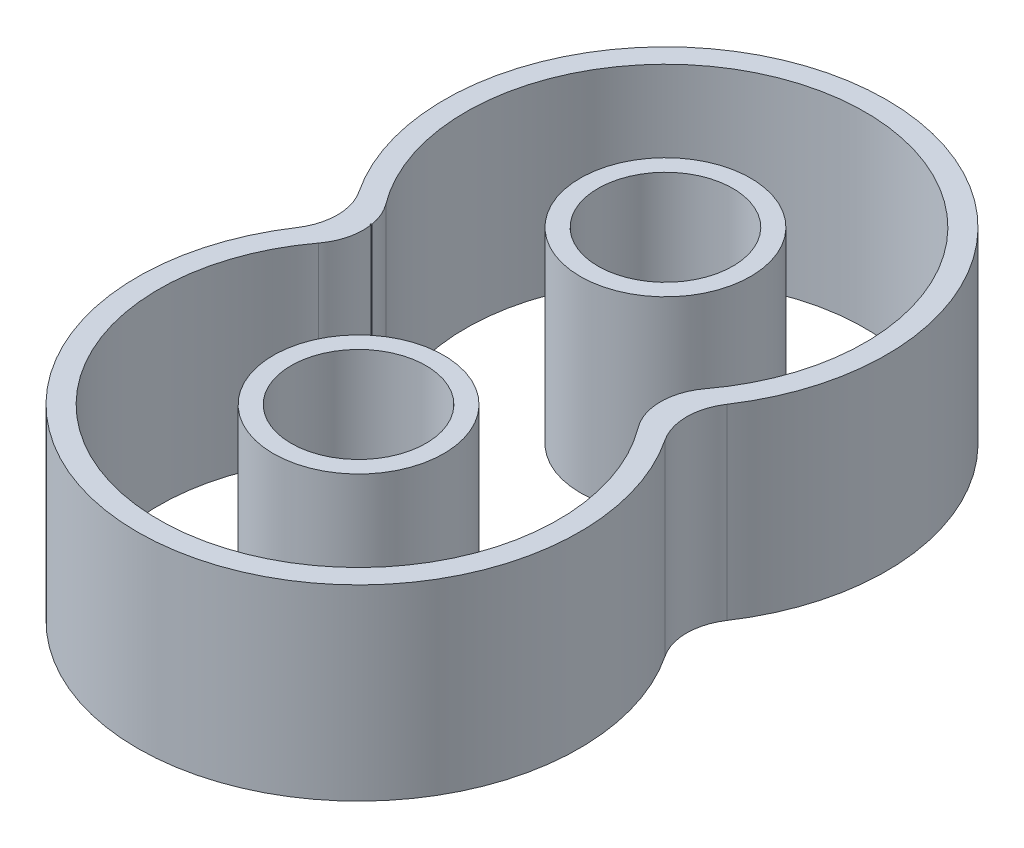
ISO-10303-21;
HEADER;
FILE_DESCRIPTION(('STEP AP214'),'2;1');
FILE_NAME('part.step','',(''),(''),'','','');
FILE_SCHEMA(('AUTOMOTIVE_DESIGN { 1 0 10303 214 1 1 1 1 }'));
ENDSEC;
DATA;
#1=APPLICATION_CONTEXT('core data for automotive mechanical design processes');
#2=APPLICATION_PROTOCOL_DEFINITION('international standard','automotive_design',2000,#1);
#3=PRODUCT_CONTEXT('',#1,'mechanical');
#4=PRODUCT('Part','Part','',(#3));
#5=PRODUCT_RELATED_PRODUCT_CATEGORY('part','',(#4));
#6=PRODUCT_DEFINITION_FORMATION('','',#4);
#7=PRODUCT_DEFINITION_CONTEXT('part definition',#1,'design');
#8=PRODUCT_DEFINITION('design','',#6,#7);
#9=PRODUCT_DEFINITION_SHAPE('','',#8);
#10=(LENGTH_UNIT() NAMED_UNIT(*) SI_UNIT(.MILLI.,.METRE.));
#11=(NAMED_UNIT(*) PLANE_ANGLE_UNIT() SI_UNIT($,.RADIAN.));
#12=(NAMED_UNIT(*) SI_UNIT($,.STERADIAN.) SOLID_ANGLE_UNIT());
#13=UNCERTAINTY_MEASURE_WITH_UNIT(LENGTH_MEASURE(1.E-05),#10,'distance_accuracy_value','');
#14=(GEOMETRIC_REPRESENTATION_CONTEXT(3) GLOBAL_UNCERTAINTY_ASSIGNED_CONTEXT((#13)) GLOBAL_UNIT_ASSIGNED_CONTEXT((#10,
#11,#12)) REPRESENTATION_CONTEXT('',''));
#15=CARTESIAN_POINT('',(0.,0.,0.));
#16=DIRECTION('',(0.,0.,1.));
#17=DIRECTION('',(1.,0.,0.));
#18=AXIS2_PLACEMENT_3D('',#15,#16,#17);
#19=CARTESIAN_POINT('',(-1.98283621732118,100.,81.9317745282291));
#20=DIRECTION('',(0.,-1.,0.));
#21=DIRECTION('',(0.,0.,-1.));
#22=AXIS2_PLACEMENT_3D('',#19,#20,#21);
#23=CYLINDRICAL_SURFACE('',#22,45.5);
#24=CARTESIAN_POINT('',(-1.98283621732118,100.,81.9317745282291));
#25=DIRECTION('',(0.,1.,0.));
#26=DIRECTION('',(0.,0.,1.));
#27=AXIS2_PLACEMENT_3D('',#24,#25,#26);
#28=CIRCLE('',#27,45.5);
#29=CARTESIAN_POINT('',(-1.98283621732118,100.,127.431774528229));
#30=VERTEX_POINT('',#29);
#31=EDGE_CURVE('E79',#30,#30,#28,.T.);
#32=ORIENTED_EDGE('',*,*,#31,.F.);
#33=EDGE_LOOP('',(#32));
#34=FACE_BOUND('',#33,.T.);
#35=CARTESIAN_POINT('',(-1.98283621732118,0.,81.9317745282291));
#36=DIRECTION('',(0.,1.,0.));
#37=DIRECTION('',(0.,0.,1.));
#38=AXIS2_PLACEMENT_3D('',#35,#36,#37);
#39=CIRCLE('',#38,45.5);
#40=CARTESIAN_POINT('',(-1.98283621732118,0.,127.431774528229));
#41=VERTEX_POINT('',#40);
#42=EDGE_CURVE('E85',#41,#41,#39,.T.);
#43=ORIENTED_EDGE('',*,*,#42,.T.);
#44=EDGE_LOOP('',(#43));
#45=FACE_BOUND('',#44,.T.);
#46=ADVANCED_FACE('F72',(#34,#45),#23,.T.);
#47=CARTESIAN_POINT('',(-1.98283621732118,100.,81.9317745282291));
#48=DIRECTION('',(0.,-1.,0.));
#49=DIRECTION('',(0.,0.,-1.));
#50=AXIS2_PLACEMENT_3D('',#47,#48,#49);
#51=CYLINDRICAL_SURFACE('',#50,36.);
#52=CARTESIAN_POINT('',(-1.98283621732118,100.,81.9317745282291));
#53=DIRECTION('',(0.,1.,0.));
#54=DIRECTION('',(0.,0.,1.));
#55=AXIS2_PLACEMENT_3D('',#52,#53,#54);
#56=CIRCLE('',#55,36.);
#57=CARTESIAN_POINT('',(-1.98283621732118,100.,117.931774528229));
#58=VERTEX_POINT('',#57);
#59=EDGE_CURVE('E12',#58,#58,#56,.T.);
#60=ORIENTED_EDGE('',*,*,#59,.T.);
#61=EDGE_LOOP('',(#60));
#62=FACE_BOUND('',#61,.T.);
#63=CARTESIAN_POINT('',(-1.98283621732118,0.,81.9317745282291));
#64=DIRECTION('',(0.,1.,0.));
#65=DIRECTION('',(0.,0.,1.));
#66=AXIS2_PLACEMENT_3D('',#63,#64,#65);
#67=CIRCLE('',#66,36.);
#68=CARTESIAN_POINT('',(-1.98283621732118,0.,117.931774528229));
#69=VERTEX_POINT('',#68);
#70=EDGE_CURVE('E75',#69,#69,#67,.T.);
#71=ORIENTED_EDGE('',*,*,#70,.F.);
#72=EDGE_LOOP('',(#71));
#73=FACE_BOUND('',#72,.T.);
#74=ADVANCED_FACE('F94',(#62,#73),#51,.F.);
#75=CARTESIAN_POINT('',(0.,100.,0.));
#76=DIRECTION('',(0.,1.,0.));
#77=DIRECTION('',(0.,0.,1.));
#78=AXIS2_PLACEMENT_3D('',#75,#76,#77);
#79=PLANE('',#78);
#80=ORIENTED_EDGE('',*,*,#31,.T.);
#81=EDGE_LOOP('',(#80));
#82=FACE_BOUND('',#81,.T.);
#83=ORIENTED_EDGE('',*,*,#59,.F.);
#84=EDGE_LOOP('',(#83));
#85=FACE_BOUND('',#84,.T.);
#86=ADVANCED_FACE('F96',(#82,#85),#79,.T.);
#87=CARTESIAN_POINT('',(0.,0.,0.));
#88=DIRECTION('',(0.,1.,0.));
#89=DIRECTION('',(0.,0.,1.));
#90=AXIS2_PLACEMENT_3D('',#87,#88,#89);
#91=PLANE('',#90);
#92=ORIENTED_EDGE('',*,*,#42,.F.);
#93=EDGE_LOOP('',(#92));
#94=FACE_BOUND('',#93,.T.);
#95=ORIENTED_EDGE('',*,*,#70,.T.);
#96=EDGE_LOOP('',(#95));
#97=FACE_BOUND('',#96,.T.);
#98=ADVANCED_FACE('F92',(#94,#97),#91,.F.);
#99=CLOSED_SHELL('',(#46,#74,#86,#98));
#100=MANIFOLD_SOLID_BREP('B2',#99);
#101=CARTESIAN_POINT('',(-1.98283621732118,100.,-81.9317745282293));
#102=DIRECTION('',(0.,-1.,0.));
#103=DIRECTION('',(0.,0.,-1.));
#104=AXIS2_PLACEMENT_3D('',#101,#102,#103);
#105=CYLINDRICAL_SURFACE('',#104,45.5);
#106=CARTESIAN_POINT('',(-1.98283621732118,100.,-81.9317745282293));
#107=DIRECTION('',(0.,1.,0.));
#108=DIRECTION('',(0.,0.,1.));
#109=AXIS2_PLACEMENT_3D('',#106,#107,#108);
#110=CIRCLE('',#109,45.5);
#111=CARTESIAN_POINT('',(-1.98283621732118,100.,-36.4317745282293));
#112=VERTEX_POINT('',#111);
#113=EDGE_CURVE('E156',#112,#112,#110,.T.);
#114=ORIENTED_EDGE('',*,*,#113,.F.);
#115=EDGE_LOOP('',(#114));
#116=FACE_BOUND('',#115,.T.);
#117=CARTESIAN_POINT('',(-1.98283621732118,0.,-81.9317745282293));
#118=DIRECTION('',(0.,1.,0.));
#119=DIRECTION('',(0.,0.,1.));
#120=AXIS2_PLACEMENT_3D('',#117,#118,#119);
#121=CIRCLE('',#120,45.5);
#122=CARTESIAN_POINT('',(-1.98283621732118,0.,-36.4317745282293));
#123=VERTEX_POINT('',#122);
#124=EDGE_CURVE('E162',#123,#123,#121,.T.);
#125=ORIENTED_EDGE('',*,*,#124,.T.);
#126=EDGE_LOOP('',(#125));
#127=FACE_BOUND('',#126,.T.);
#128=ADVANCED_FACE('F149',(#116,#127),#105,.T.);
#129=CARTESIAN_POINT('',(-1.98283621732118,100.,-81.9317745282293));
#130=DIRECTION('',(0.,-1.,0.));
#131=DIRECTION('',(0.,0.,-1.));
#132=AXIS2_PLACEMENT_3D('',#129,#130,#131);
#133=CYLINDRICAL_SURFACE('',#132,36.);
#134=CARTESIAN_POINT('',(-1.98283621732118,100.,-81.9317745282293));
#135=DIRECTION('',(0.,1.,0.));
#136=DIRECTION('',(0.,0.,1.));
#137=AXIS2_PLACEMENT_3D('',#134,#135,#136);
#138=CIRCLE('',#137,36.);
#139=CARTESIAN_POINT('',(-1.98283621732118,100.,-45.9317745282293));
#140=VERTEX_POINT('',#139);
#141=EDGE_CURVE('E71',#140,#140,#138,.T.);
#142=ORIENTED_EDGE('',*,*,#141,.T.);
#143=EDGE_LOOP('',(#142));
#144=FACE_BOUND('',#143,.T.);
#145=CARTESIAN_POINT('',(-1.98283621732118,0.,-81.9317745282293));
#146=DIRECTION('',(0.,1.,0.));
#147=DIRECTION('',(0.,0.,1.));
#148=AXIS2_PLACEMENT_3D('',#145,#146,#147);
#149=CIRCLE('',#148,36.);
#150=CARTESIAN_POINT('',(-1.98283621732118,0.,-45.9317745282293));
#151=VERTEX_POINT('',#150);
#152=EDGE_CURVE('E152',#151,#151,#149,.T.);
#153=ORIENTED_EDGE('',*,*,#152,.F.);
#154=EDGE_LOOP('',(#153));
#155=FACE_BOUND('',#154,.T.);
#156=ADVANCED_FACE('F171',(#144,#155),#133,.F.);
#157=CARTESIAN_POINT('',(0.,100.,0.));
#158=DIRECTION('',(0.,1.,0.));
#159=DIRECTION('',(0.,0.,1.));
#160=AXIS2_PLACEMENT_3D('',#157,#158,#159);
#161=PLANE('',#160);
#162=ORIENTED_EDGE('',*,*,#113,.T.);
#163=EDGE_LOOP('',(#162));
#164=FACE_BOUND('',#163,.T.);
#165=ORIENTED_EDGE('',*,*,#141,.F.);
#166=EDGE_LOOP('',(#165));
#167=FACE_BOUND('',#166,.T.);
#168=ADVANCED_FACE('F173',(#164,#167),#161,.T.);
#169=CARTESIAN_POINT('',(0.,0.,0.));
#170=DIRECTION('',(0.,1.,0.));
#171=DIRECTION('',(0.,0.,1.));
#172=AXIS2_PLACEMENT_3D('',#169,#170,#171);
#173=PLANE('',#172);
#174=ORIENTED_EDGE('',*,*,#124,.F.);
#175=EDGE_LOOP('',(#174));
#176=FACE_BOUND('',#175,.T.);
#177=ORIENTED_EDGE('',*,*,#152,.T.);
#178=EDGE_LOOP('',(#177));
#179=FACE_BOUND('',#178,.T.);
#180=ADVANCED_FACE('F169',(#176,#179),#173,.F.);
#181=CLOSED_SHELL('',(#128,#156,#168,#180));
#182=MANIFOLD_SOLID_BREP('B7',#181);
#183=CARTESIAN_POINT('',(-125.25920559196,100.,0.));
#184=DIRECTION('',(0.,-1.,0.));
#185=DIRECTION('',(0.,0.,-1.));
#186=AXIS2_PLACEMENT_3D('',#183,#184,#185);
#187=CYLINDRICAL_SURFACE('',#186,30.);
#188=CARTESIAN_POINT('',(-125.25920559196,0.,0.));
#189=DIRECTION('',(0.,1.,0.));
#190=DIRECTION('',(0.,0.,1.));
#191=AXIS2_PLACEMENT_3D('',#188,#189,#190);
#192=CIRCLE('',#191,30.);
#193=CARTESIAN_POINT('',(-100.274105053116,0.,-16.6055638586549));
#194=VERTEX_POINT('',#193);
#195=CARTESIAN_POINT('',(-100.274105053116,0.,16.6055638586547));
#196=VERTEX_POINT('',#195);
#197=EDGE_CURVE('E351',#194,#196,#192,.F.);
#198=ORIENTED_EDGE('',*,*,#197,.T.);
#199=DIRECTION('',(0.,-1.,0.));
#200=VECTOR('',#199,1.);
#201=CARTESIAN_POINT('',(-100.274105053116,100.,16.6055638586547));
#202=LINE('',#201,#200);
#203=CARTESIAN_POINT('',(-100.274105053116,100.,16.6055638586547));
#204=VERTEX_POINT('',#203);
#205=EDGE_CURVE('E147',#204,#196,#202,.T.);
#206=ORIENTED_EDGE('',*,*,#205,.F.);
#207=CARTESIAN_POINT('',(-125.25920559196,100.,0.));
#208=DIRECTION('',(0.,1.,0.));
#209=DIRECTION('',(0.,0.,1.));
#210=AXIS2_PLACEMENT_3D('',#207,#208,#209);
#211=CIRCLE('',#210,30.);
#212=CARTESIAN_POINT('',(-100.274105053116,100.,-16.6055638586549));
#213=VERTEX_POINT('',#212);
#214=EDGE_CURVE('E316',#213,#204,#211,.F.);
#215=ORIENTED_EDGE('',*,*,#214,.F.);
#216=DIRECTION('',(0.,-1.,0.));
#217=VECTOR('',#216,1.);
#218=CARTESIAN_POINT('',(-100.274105053116,100.,-16.6055638586549));
#219=LINE('',#218,#217);
#220=EDGE_CURVE('E358',#213,#194,#219,.T.);
#221=ORIENTED_EDGE('',*,*,#220,.T.);
#222=EDGE_LOOP('',(#198,#206,#215,#221));
#223=FACE_BOUND('',#222,.T.);
#224=ADVANCED_FACE('F217',(#223),#187,.F.);
#225=CARTESIAN_POINT('',(-1.98283621732118,100.,81.9317745282291));
#226=DIRECTION('',(0.,-1.,0.));
#227=DIRECTION('',(0.,0.,-1.));
#228=AXIS2_PLACEMENT_3D('',#225,#226,#227);
#229=CYLINDRICAL_SURFACE('',#228,118.019859895681);
#230=CARTESIAN_POINT('',(-1.98283621732118,0.,81.9317745282291));
#231=DIRECTION('',(0.,1.,0.));
#232=DIRECTION('',(0.,0.,1.));
#233=AXIS2_PLACEMENT_3D('',#230,#231,#232);
#234=CIRCLE('',#233,118.019859895681);
#235=CARTESIAN_POINT('',(96.3084326184739,0.,16.6055638586547));
#236=VERTEX_POINT('',#235);
#237=EDGE_CURVE('E321',#196,#236,#234,.T.);
#238=ORIENTED_EDGE('',*,*,#237,.T.);
#239=DIRECTION('',(0.,-1.,0.));
#240=VECTOR('',#239,1.);
#241=CARTESIAN_POINT('',(96.3084326184739,100.,16.6055638586547));
#242=LINE('',#241,#240);
#243=CARTESIAN_POINT('',(96.3084326184739,100.,16.6055638586547));
#244=VERTEX_POINT('',#243);
#245=EDGE_CURVE('E227',#244,#236,#242,.T.);
#246=ORIENTED_EDGE('',*,*,#245,.F.);
#247=CARTESIAN_POINT('',(-1.98283621732118,100.,81.9317745282291));
#248=DIRECTION('',(0.,1.,0.));
#249=DIRECTION('',(0.,0.,1.));
#250=AXIS2_PLACEMENT_3D('',#247,#248,#249);
#251=CIRCLE('',#250,118.019859895681);
#252=EDGE_CURVE('E310',#204,#244,#251,.T.);
#253=ORIENTED_EDGE('',*,*,#252,.F.);
#254=ORIENTED_EDGE('',*,*,#205,.T.);
#255=EDGE_LOOP('',(#238,#246,#253,#254));
#256=FACE_BOUND('',#255,.T.);
#257=ADVANCED_FACE('F320',(#256),#229,.T.);
#258=CARTESIAN_POINT('',(121.293533157318,100.,0.));
#259=DIRECTION('',(0.,-1.,0.));
#260=DIRECTION('',(0.,0.,-1.));
#261=AXIS2_PLACEMENT_3D('',#258,#259,#260);
#262=CYLINDRICAL_SURFACE('',#261,30.);
#263=CARTESIAN_POINT('',(121.293533157318,0.,0.));
#264=DIRECTION('',(0.,1.,0.));
#265=DIRECTION('',(0.,0.,1.));
#266=AXIS2_PLACEMENT_3D('',#263,#264,#265);
#267=CIRCLE('',#266,30.);
#268=CARTESIAN_POINT('',(96.308432618474,0.,-16.605563858655));
#269=VERTEX_POINT('',#268);
#270=EDGE_CURVE('E274',#236,#269,#267,.F.);
#271=ORIENTED_EDGE('',*,*,#270,.T.);
#272=DIRECTION('',(0.,-1.,0.));
#273=VECTOR('',#272,1.);
#274=CARTESIAN_POINT('',(96.308432618474,100.,-16.605563858655));
#275=LINE('',#274,#273);
#276=CARTESIAN_POINT('',(96.308432618474,100.,-16.605563858655));
#277=VERTEX_POINT('',#276);
#278=EDGE_CURVE('E322',#277,#269,#275,.T.);
#279=ORIENTED_EDGE('',*,*,#278,.F.);
#280=CARTESIAN_POINT('',(121.293533157318,100.,0.));
#281=DIRECTION('',(0.,1.,0.));
#282=DIRECTION('',(0.,0.,1.));
#283=AXIS2_PLACEMENT_3D('',#280,#281,#282);
#284=CIRCLE('',#283,30.);
#285=EDGE_CURVE('E314',#244,#277,#284,.F.);
#286=ORIENTED_EDGE('',*,*,#285,.F.);
#287=ORIENTED_EDGE('',*,*,#245,.T.);
#288=EDGE_LOOP('',(#271,#279,#286,#287));
#289=FACE_BOUND('',#288,.T.);
#290=ADVANCED_FACE('F324',(#289),#262,.F.);
#291=CARTESIAN_POINT('',(0.,100.,-4.41603826357619));
#292=DIRECTION('',(0.,0.,-1.));
#293=DIRECTION('',(-1.,0.,0.));
#294=AXIS2_PLACEMENT_3D('',#291,#292,#293);
#295=PLANE('',#294);
#296=DIRECTION('',(1.,0.,0.));
#297=VECTOR('',#296,1.);
#298=CARTESIAN_POINT('',(0.,0.,-4.41603826357619));
#299=LINE('',#298,#297);
#300=CARTESIAN_POINT('',(-82.4361926163398,0.,-4.41603826357619));
#301=VERTEX_POINT('',#300);
#302=CARTESIAN_POINT('',(-81.6718701521779,0.,-4.41603826357619));
#303=VERTEX_POINT('',#302);
#304=EDGE_CURVE('E330',#301,#303,#299,.T.);
#305=ORIENTED_EDGE('',*,*,#304,.F.);
#306=DIRECTION('',(0.,-1.,0.));
#307=VECTOR('',#306,1.);
#308=CARTESIAN_POINT('',(-82.4361926163398,100.,-4.41603826357619));
#309=LINE('',#308,#307);
#310=CARTESIAN_POINT('',(-82.4361926163398,100.,-4.41603826357619));
#311=VERTEX_POINT('',#310);
#312=EDGE_CURVE('E221',#311,#301,#309,.T.);
#313=ORIENTED_EDGE('',*,*,#312,.F.);
#314=DIRECTION('',(1.,0.,0.));
#315=VECTOR('',#314,1.);
#316=CARTESIAN_POINT('',(0.,100.,-4.41603826357619));
#317=LINE('',#316,#315);
#318=CARTESIAN_POINT('',(-81.6718701521779,100.,-4.41603826357619));
#319=VERTEX_POINT('',#318);
#320=EDGE_CURVE('E357',#311,#319,#317,.T.);
#321=ORIENTED_EDGE('',*,*,#320,.T.);
#322=DIRECTION('',(0.,-1.,0.));
#323=VECTOR('',#322,1.);
#324=CARTESIAN_POINT('',(-81.6718701521779,100.,-4.41603826357619));
#325=LINE('',#324,#323);
#326=EDGE_CURVE('E326',#319,#303,#325,.T.);
#327=ORIENTED_EDGE('',*,*,#326,.T.);
#328=EDGE_LOOP('',(#305,#313,#321,#327));
#329=FACE_BOUND('',#328,.T.);
#330=ADVANCED_FACE('F219',(#329),#295,.T.);
#331=CARTESIAN_POINT('',(-1.98283621732118,100.,81.9317745282291));
#332=DIRECTION('',(0.,-1.,0.));
#333=DIRECTION('',(0.,0.,-1.));
#334=AXIS2_PLACEMENT_3D('',#331,#332,#333);
#335=CYLINDRICAL_SURFACE('',#334,118.019859895681);
#336=CARTESIAN_POINT('',(-1.98283621732118,0.,81.9317745282291));
#337=DIRECTION('',(0.,1.,0.));
#338=DIRECTION('',(0.,0.,1.));
#339=AXIS2_PLACEMENT_3D('',#336,#337,#338);
#340=CIRCLE('',#339,118.019859895681);
#341=CARTESIAN_POINT('',(-81.7700800849015,0.,-5.03191355945162));
#342=VERTEX_POINT('',#341);
#343=EDGE_CURVE('E333',#342,#301,#340,.T.);
#344=ORIENTED_EDGE('',*,*,#343,.F.);
#345=DIRECTION('',(0.,-1.,0.));
#346=VECTOR('',#345,1.);
#347=CARTESIAN_POINT('',(-81.7700800849015,100.,-5.03191355945162));
#348=LINE('',#347,#346);
#349=CARTESIAN_POINT('',(-81.7700800849015,100.,-5.03191355945162));
#350=VERTEX_POINT('',#349);
#351=EDGE_CURVE('E369',#350,#342,#348,.T.);
#352=ORIENTED_EDGE('',*,*,#351,.F.);
#353=CARTESIAN_POINT('',(-1.98283621732118,100.,81.9317745282291));
#354=DIRECTION('',(0.,1.,0.));
#355=DIRECTION('',(0.,0.,1.));
#356=AXIS2_PLACEMENT_3D('',#353,#354,#355);
#357=CIRCLE('',#356,118.019859895681);
#358=EDGE_CURVE('E378',#350,#311,#357,.T.);
#359=ORIENTED_EDGE('',*,*,#358,.T.);
#360=ORIENTED_EDGE('',*,*,#312,.T.);
#361=EDGE_LOOP('',(#344,#352,#359,#360));
#362=FACE_BOUND('',#361,.T.);
#363=ADVANCED_FACE('F376',(#362),#335,.F.);
#364=CARTESIAN_POINT('',(-111.345066913812,100.,0.));
#365=DIRECTION('',(0.,-1.,0.));
#366=DIRECTION('',(0.,0.,-1.));
#367=AXIS2_PLACEMENT_3D('',#364,#365,#366);
#368=CYLINDRICAL_SURFACE('',#367,30.);
#369=CARTESIAN_POINT('',(-111.345066913812,0.,0.));
#370=DIRECTION('',(0.,1.,0.));
#371=DIRECTION('',(0.,0.,1.));
#372=AXIS2_PLACEMENT_3D('',#369,#370,#371);
#373=CIRCLE('',#372,30.);
#374=CARTESIAN_POINT('',(-87.3355967724256,0.,-17.9873662199305));
#375=VERTEX_POINT('',#374);
#376=EDGE_CURVE('E336',#375,#342,#373,.F.);
#377=ORIENTED_EDGE('',*,*,#376,.F.);
#378=DIRECTION('',(0.,-1.,0.));
#379=VECTOR('',#378,1.);
#380=CARTESIAN_POINT('',(-87.3355967724256,100.,-17.9873662199305));
#381=LINE('',#380,#379);
#382=CARTESIAN_POINT('',(-87.3355967724256,100.,-17.9873662199305));
#383=VERTEX_POINT('',#382);
#384=EDGE_CURVE('E368',#383,#375,#381,.T.);
#385=ORIENTED_EDGE('',*,*,#384,.F.);
#386=CARTESIAN_POINT('',(-111.345066913812,100.,0.));
#387=DIRECTION('',(0.,1.,0.));
#388=DIRECTION('',(0.,0.,1.));
#389=AXIS2_PLACEMENT_3D('',#386,#387,#388);
#390=CIRCLE('',#389,30.);
#391=EDGE_CURVE('E387',#383,#350,#390,.F.);
#392=ORIENTED_EDGE('',*,*,#391,.T.);
#393=ORIENTED_EDGE('',*,*,#351,.T.);
#394=EDGE_LOOP('',(#377,#385,#392,#393));
#395=FACE_BOUND('',#394,.T.);
#396=ADVANCED_FACE('F385',(#395),#368,.T.);
#397=CARTESIAN_POINT('',(-1.98283621732118,100.,-81.9317745282293));
#398=DIRECTION('',(0.,-1.,0.));
#399=DIRECTION('',(0.,0.,-1.));
#400=AXIS2_PLACEMENT_3D('',#397,#398,#399);
#401=CYLINDRICAL_SURFACE('',#400,106.648868199693);
#402=CARTESIAN_POINT('',(-1.98283621732118,0.,-81.9317745282293));
#403=DIRECTION('',(0.,1.,0.));
#404=DIRECTION('',(0.,0.,1.));
#405=AXIS2_PLACEMENT_3D('',#402,#403,#404);
#406=CIRCLE('',#405,106.648868199693);
#407=CARTESIAN_POINT('',(83.3699243377832,0.,-17.9873662199305));
#408=VERTEX_POINT('',#407);
#409=EDGE_CURVE('E339',#408,#375,#406,.T.);
#410=ORIENTED_EDGE('',*,*,#409,.F.);
#411=DIRECTION('',(0.,-1.,0.));
#412=VECTOR('',#411,1.);
#413=CARTESIAN_POINT('',(83.3699243377832,100.,-17.9873662199305));
#414=LINE('',#413,#412);
#415=CARTESIAN_POINT('',(83.3699243377832,100.,-17.9873662199305));
#416=VERTEX_POINT('',#415);
#417=EDGE_CURVE('E366',#416,#408,#414,.T.);
#418=ORIENTED_EDGE('',*,*,#417,.F.);
#419=CARTESIAN_POINT('',(-1.98283621732118,100.,-81.9317745282293));
#420=DIRECTION('',(0.,1.,0.));
#421=DIRECTION('',(0.,0.,1.));
#422=AXIS2_PLACEMENT_3D('',#419,#420,#421);
#423=CIRCLE('',#422,106.648868199693);
#424=EDGE_CURVE('E392',#416,#383,#423,.T.);
#425=ORIENTED_EDGE('',*,*,#424,.T.);
#426=ORIENTED_EDGE('',*,*,#384,.T.);
#427=EDGE_LOOP('',(#410,#418,#425,#426));
#428=FACE_BOUND('',#427,.T.);
#429=ADVANCED_FACE('F394',(#428),#401,.F.);
#430=CARTESIAN_POINT('',(107.379394479169,100.,0.));
#431=DIRECTION('',(0.,-1.,0.));
#432=DIRECTION('',(0.,0.,-1.));
#433=AXIS2_PLACEMENT_3D('',#430,#431,#432);
#434=CYLINDRICAL_SURFACE('',#433,30.);
#435=CARTESIAN_POINT('',(107.379394479169,0.,0.));
#436=DIRECTION('',(0.,1.,0.));
#437=DIRECTION('',(0.,0.,1.));
#438=AXIS2_PLACEMENT_3D('',#435,#436,#437);
#439=CIRCLE('',#438,30.);
#440=CARTESIAN_POINT('',(83.3699243377832,0.,17.9873662199303));
#441=VERTEX_POINT('',#440);
#442=EDGE_CURVE('E342',#408,#441,#439,.T.);
#443=ORIENTED_EDGE('',*,*,#442,.T.);
#444=DIRECTION('',(0.,-1.,0.));
#445=VECTOR('',#444,1.);
#446=CARTESIAN_POINT('',(83.3699243377832,100.,17.9873662199303));
#447=LINE('',#446,#445);
#448=CARTESIAN_POINT('',(83.3699243377832,100.,17.9873662199303));
#449=VERTEX_POINT('',#448);
#450=EDGE_CURVE('E364',#449,#441,#447,.T.);
#451=ORIENTED_EDGE('',*,*,#450,.F.);
#452=CARTESIAN_POINT('',(107.379394479169,100.,0.));
#453=DIRECTION('',(0.,1.,0.));
#454=DIRECTION('',(0.,0.,1.));
#455=AXIS2_PLACEMENT_3D('',#452,#453,#454);
#456=CIRCLE('',#455,30.);
#457=EDGE_CURVE('E396',#416,#449,#456,.T.);
#458=ORIENTED_EDGE('',*,*,#457,.F.);
#459=ORIENTED_EDGE('',*,*,#417,.T.);
#460=EDGE_LOOP('',(#443,#451,#458,#459));
#461=FACE_BOUND('',#460,.T.);
#462=ADVANCED_FACE('F415',(#461),#434,.T.);
#463=CARTESIAN_POINT('',(-1.98283621732118,100.,81.9317745282291));
#464=DIRECTION('',(0.,-1.,0.));
#465=DIRECTION('',(0.,0.,-1.));
#466=AXIS2_PLACEMENT_3D('',#463,#464,#465);
#467=CYLINDRICAL_SURFACE('',#466,106.648868199693);
#468=CARTESIAN_POINT('',(-1.98283621732118,0.,81.9317745282291));
#469=DIRECTION('',(0.,1.,0.));
#470=DIRECTION('',(0.,0.,1.));
#471=AXIS2_PLACEMENT_3D('',#468,#469,#470);
#472=CIRCLE('',#471,106.648868199693);
#473=CARTESIAN_POINT('',(-87.3355967724256,0.,17.9873662199303));
#474=VERTEX_POINT('',#473);
#475=EDGE_CURVE('E345',#474,#441,#472,.T.);
#476=ORIENTED_EDGE('',*,*,#475,.F.);
#477=DIRECTION('',(0.,-1.,0.));
#478=VECTOR('',#477,1.);
#479=CARTESIAN_POINT('',(-87.3355967724256,100.,17.9873662199303));
#480=LINE('',#479,#478);
#481=CARTESIAN_POINT('',(-87.3355967724256,100.,17.9873662199303));
#482=VERTEX_POINT('',#481);
#483=EDGE_CURVE('E362',#482,#474,#480,.T.);
#484=ORIENTED_EDGE('',*,*,#483,.F.);
#485=CARTESIAN_POINT('',(-1.98283621732118,100.,81.9317745282291));
#486=DIRECTION('',(0.,1.,0.));
#487=DIRECTION('',(0.,0.,1.));
#488=AXIS2_PLACEMENT_3D('',#485,#486,#487);
#489=CIRCLE('',#488,106.648868199693);
#490=EDGE_CURVE('E398',#482,#449,#489,.T.);
#491=ORIENTED_EDGE('',*,*,#490,.T.);
#492=ORIENTED_EDGE('',*,*,#450,.T.);
#493=EDGE_LOOP('',(#476,#484,#491,#492));
#494=FACE_BOUND('',#493,.T.);
#495=ADVANCED_FACE('F413',(#494),#467,.F.);
#496=CARTESIAN_POINT('',(-111.345066913812,100.,0.));
#497=DIRECTION('',(0.,-1.,0.));
#498=DIRECTION('',(0.,0.,-1.));
#499=AXIS2_PLACEMENT_3D('',#496,#497,#498);
#500=CYLINDRICAL_SURFACE('',#499,30.);
#501=CARTESIAN_POINT('',(-111.345066913812,0.,0.));
#502=DIRECTION('',(0.,1.,0.));
#503=DIRECTION('',(0.,0.,1.));
#504=AXIS2_PLACEMENT_3D('',#501,#502,#503);
#505=CIRCLE('',#504,30.);
#506=EDGE_CURVE('E348',#303,#474,#505,.F.);
#507=ORIENTED_EDGE('',*,*,#506,.F.);
#508=ORIENTED_EDGE('',*,*,#326,.F.);
#509=CARTESIAN_POINT('',(-111.345066913812,100.,0.));
#510=DIRECTION('',(0.,1.,0.));
#511=DIRECTION('',(0.,0.,1.));
#512=AXIS2_PLACEMENT_3D('',#509,#510,#511);
#513=CIRCLE('',#512,30.);
#514=EDGE_CURVE('E404',#319,#482,#513,.F.);
#515=ORIENTED_EDGE('',*,*,#514,.T.);
#516=ORIENTED_EDGE('',*,*,#483,.T.);
#517=EDGE_LOOP('',(#507,#508,#515,#516));
#518=FACE_BOUND('',#517,.T.);
#519=ADVANCED_FACE('F408',(#518),#500,.T.);
#520=CARTESIAN_POINT('',(-1.98283621732118,100.,-81.9317745282293));
#521=DIRECTION('',(0.,-1.,0.));
#522=DIRECTION('',(0.,0.,-1.));
#523=AXIS2_PLACEMENT_3D('',#520,#521,#522);
#524=CYLINDRICAL_SURFACE('',#523,118.019859895681);
#525=CARTESIAN_POINT('',(-1.98283621732118,0.,-81.9317745282293));
#526=DIRECTION('',(0.,1.,0.));
#527=DIRECTION('',(0.,0.,1.));
#528=AXIS2_PLACEMENT_3D('',#525,#526,#527);
#529=CIRCLE('',#528,118.019859895681);
#530=EDGE_CURVE('E280',#269,#194,#529,.T.);
#531=ORIENTED_EDGE('',*,*,#530,.T.);
#532=ORIENTED_EDGE('',*,*,#220,.F.);
#533=CARTESIAN_POINT('',(-1.98283621732118,100.,-81.9317745282293));
#534=DIRECTION('',(0.,1.,0.));
#535=DIRECTION('',(0.,0.,1.));
#536=AXIS2_PLACEMENT_3D('',#533,#534,#535);
#537=CIRCLE('',#536,118.019859895681);
#538=EDGE_CURVE('E236',#277,#213,#537,.T.);
#539=ORIENTED_EDGE('',*,*,#538,.F.);
#540=ORIENTED_EDGE('',*,*,#278,.T.);
#541=EDGE_LOOP('',(#531,#532,#539,#540));
#542=FACE_BOUND('',#541,.T.);
#543=ADVANCED_FACE('F434',(#542),#524,.T.);
#544=CARTESIAN_POINT('',(0.,100.,0.));
#545=DIRECTION('',(0.,1.,0.));
#546=DIRECTION('',(0.,0.,1.));
#547=AXIS2_PLACEMENT_3D('',#544,#545,#546);
#548=PLANE('',#547);
#549=ORIENTED_EDGE('',*,*,#320,.F.);
#550=ORIENTED_EDGE('',*,*,#358,.F.);
#551=ORIENTED_EDGE('',*,*,#391,.F.);
#552=ORIENTED_EDGE('',*,*,#424,.F.);
#553=ORIENTED_EDGE('',*,*,#457,.T.);
#554=ORIENTED_EDGE('',*,*,#490,.F.);
#555=ORIENTED_EDGE('',*,*,#514,.F.);
#556=EDGE_LOOP('',(#549,#550,#551,#552,#553,#554,#555));
#557=FACE_BOUND('',#556,.T.);
#558=ORIENTED_EDGE('',*,*,#214,.T.);
#559=ORIENTED_EDGE('',*,*,#252,.T.);
#560=ORIENTED_EDGE('',*,*,#285,.T.);
#561=ORIENTED_EDGE('',*,*,#538,.T.);
#562=EDGE_LOOP('',(#558,#559,#560,#561));
#563=FACE_BOUND('',#562,.T.);
#564=ADVANCED_FACE('F312',(#557,#563),#548,.T.);
#565=CARTESIAN_POINT('',(0.,0.,0.));
#566=DIRECTION('',(0.,1.,0.));
#567=DIRECTION('',(0.,0.,1.));
#568=AXIS2_PLACEMENT_3D('',#565,#566,#567);
#569=PLANE('',#568);
#570=ORIENTED_EDGE('',*,*,#304,.T.);
#571=ORIENTED_EDGE('',*,*,#506,.T.);
#572=ORIENTED_EDGE('',*,*,#475,.T.);
#573=ORIENTED_EDGE('',*,*,#442,.F.);
#574=ORIENTED_EDGE('',*,*,#409,.T.);
#575=ORIENTED_EDGE('',*,*,#376,.T.);
#576=ORIENTED_EDGE('',*,*,#343,.T.);
#577=EDGE_LOOP('',(#570,#571,#572,#573,#574,#575,#576));
#578=FACE_BOUND('',#577,.T.);
#579=ORIENTED_EDGE('',*,*,#197,.F.);
#580=ORIENTED_EDGE('',*,*,#530,.F.);
#581=ORIENTED_EDGE('',*,*,#270,.F.);
#582=ORIENTED_EDGE('',*,*,#237,.F.);
#583=EDGE_LOOP('',(#579,#580,#581,#582));
#584=FACE_BOUND('',#583,.T.);
#585=ADVANCED_FACE('F381',(#578,#584),#569,.F.);
#586=CLOSED_SHELL('',(#224,#257,#290,#330,#363,#396,#429,#462,#495,#519,#543,#564,#585));
#587=MANIFOLD_SOLID_BREP('B66',#586);
#588=ADVANCED_BREP_SHAPE_REPRESENTATION('',(#18,#100,#182,#587),#14);
#589=SHAPE_DEFINITION_REPRESENTATION(#9,#588);
ENDSEC;
END-ISO-10303-21;
